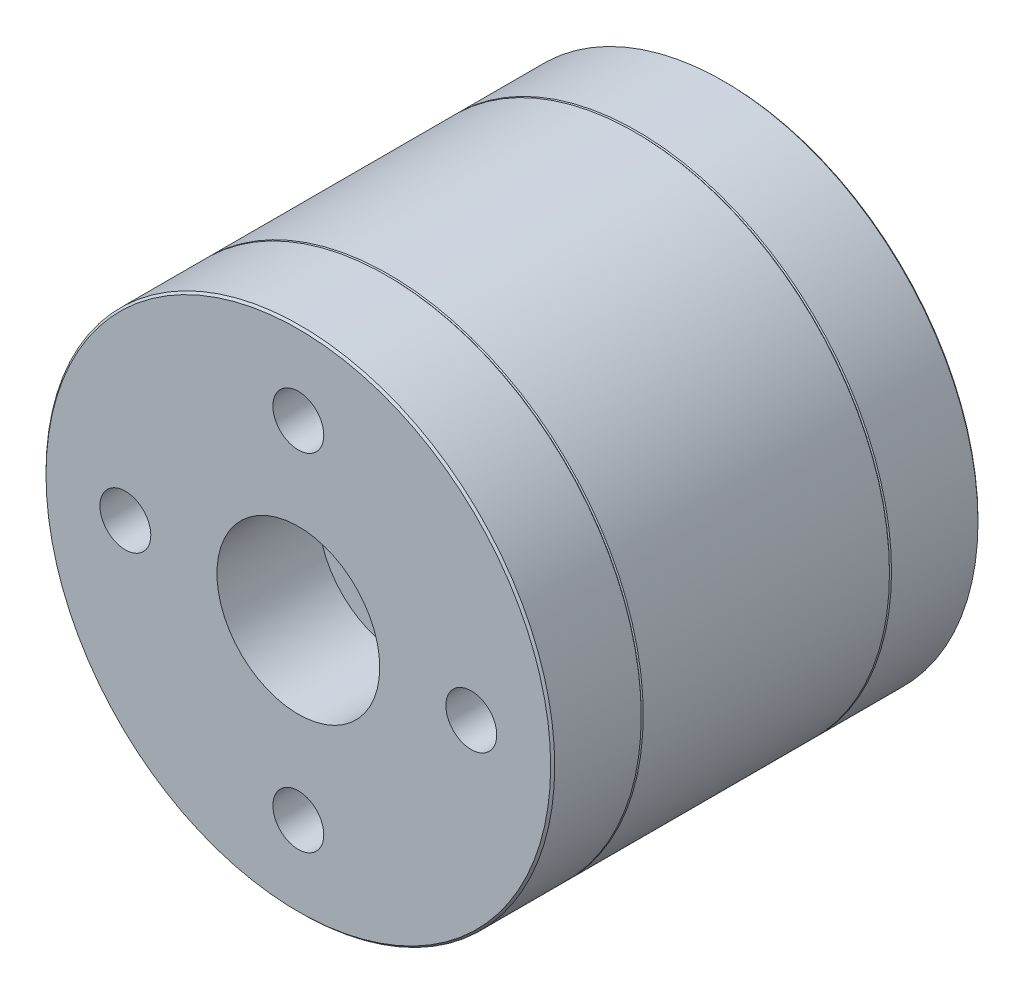
ISO-10303-21;
HEADER;
FILE_DESCRIPTION(('STEP AP214'),'2;1');
FILE_NAME('part.step','',(''),(''),'','','');
FILE_SCHEMA(('AUTOMOTIVE_DESIGN { 1 0 10303 214 1 1 1 1 }'));
ENDSEC;
DATA;
#1=APPLICATION_CONTEXT('core data for automotive mechanical design processes');
#2=APPLICATION_PROTOCOL_DEFINITION('international standard','automotive_design',2000,#1);
#3=PRODUCT_CONTEXT('',#1,'mechanical');
#4=PRODUCT('Part','Part','',(#3));
#5=PRODUCT_RELATED_PRODUCT_CATEGORY('part','',(#4));
#6=PRODUCT_DEFINITION_FORMATION('','',#4);
#7=PRODUCT_DEFINITION_CONTEXT('part definition',#1,'design');
#8=PRODUCT_DEFINITION('design','',#6,#7);
#9=PRODUCT_DEFINITION_SHAPE('','',#8);
#10=(LENGTH_UNIT() NAMED_UNIT(*) SI_UNIT(.MILLI.,.METRE.));
#11=(NAMED_UNIT(*) PLANE_ANGLE_UNIT() SI_UNIT($,.RADIAN.));
#12=(NAMED_UNIT(*) SI_UNIT($,.STERADIAN.) SOLID_ANGLE_UNIT());
#13=UNCERTAINTY_MEASURE_WITH_UNIT(LENGTH_MEASURE(1.E-05),#10,'distance_accuracy_value','');
#14=(GEOMETRIC_REPRESENTATION_CONTEXT(3) GLOBAL_UNCERTAINTY_ASSIGNED_CONTEXT((#13)) GLOBAL_UNIT_ASSIGNED_CONTEXT((#10,
#11,#12)) REPRESENTATION_CONTEXT('',''));
#15=CARTESIAN_POINT('',(0.,0.,0.));
#16=DIRECTION('',(0.,0.,1.));
#17=DIRECTION('',(1.,0.,0.));
#18=AXIS2_PLACEMENT_3D('',#15,#16,#17);
#19=CARTESIAN_POINT('',(-8.50000000000024,2.40543580379159E-13,10.501));
#20=DIRECTION('',(0.,0.,-1.));
#21=DIRECTION('',(-1.,0.,0.));
#22=AXIS2_PLACEMENT_3D('',#19,#20,#21);
#23=CYLINDRICAL_SURFACE('',#22,1.25000000000019);
#24=CARTESIAN_POINT('',(-8.50000000000024,2.40543580379159E-13,10.5));
#25=DIRECTION('',(0.,0.,1.));
#26=DIRECTION('',(1.,0.,0.));
#27=AXIS2_PLACEMENT_3D('',#24,#25,#26);
#28=CIRCLE('',#27,1.25000000000019);
#29=CARTESIAN_POINT('',(-7.25000000000005,2.40543580379159E-13,10.5));
#30=VERTEX_POINT('',#29);
#31=EDGE_CURVE('E134',#30,#30,#28,.F.);
#32=ORIENTED_EDGE('',*,*,#31,.F.);
#33=EDGE_LOOP('',(#32));
#34=FACE_BOUND('',#33,.T.);
#35=CARTESIAN_POINT('',(-8.50000000000024,2.40543580379159E-13,-7.5));
#36=DIRECTION('',(0.,0.,-1.));
#37=DIRECTION('',(-1.,0.,0.));
#38=AXIS2_PLACEMENT_3D('',#35,#36,#37);
#39=CIRCLE('',#38,1.25000000000019);
#40=CARTESIAN_POINT('',(-9.75000000000043,2.40543580379159E-13,-7.5));
#41=VERTEX_POINT('',#40);
#42=EDGE_CURVE('E62',#41,#41,#39,.F.);
#43=ORIENTED_EDGE('',*,*,#42,.F.);
#44=EDGE_LOOP('',(#43));
#45=FACE_BOUND('',#44,.T.);
#46=ADVANCED_FACE('F41',(#34,#45),#23,.F.);
#47=CARTESIAN_POINT('',(8.49999999999976,-2.41584530158434E-13,10.501));
#48=DIRECTION('',(0.,0.,-1.));
#49=DIRECTION('',(-1.,0.,0.));
#50=AXIS2_PLACEMENT_3D('',#47,#48,#49);
#51=CYLINDRICAL_SURFACE('',#50,1.25000000000039);
#52=CARTESIAN_POINT('',(8.49999999999976,-2.41584530158434E-13,10.5));
#53=DIRECTION('',(0.,0.,1.));
#54=DIRECTION('',(1.,0.,0.));
#55=AXIS2_PLACEMENT_3D('',#52,#53,#54);
#56=CIRCLE('',#55,1.25000000000039);
#57=CARTESIAN_POINT('',(9.75000000000015,-2.41584530158434E-13,10.5));
#58=VERTEX_POINT('',#57);
#59=EDGE_CURVE('E70',#58,#58,#56,.F.);
#60=ORIENTED_EDGE('',*,*,#59,.F.);
#61=EDGE_LOOP('',(#60));
#62=FACE_BOUND('',#61,.T.);
#63=CARTESIAN_POINT('',(8.49999999999976,-2.41584530158434E-13,-7.5));
#64=DIRECTION('',(0.,0.,-1.));
#65=DIRECTION('',(-1.,0.,0.));
#66=AXIS2_PLACEMENT_3D('',#63,#64,#65);
#67=CIRCLE('',#66,1.25000000000039);
#68=CARTESIAN_POINT('',(7.24999999999938,-2.41584530158434E-13,-7.5));
#69=VERTEX_POINT('',#68);
#70=EDGE_CURVE('E67',#69,#69,#67,.F.);
#71=ORIENTED_EDGE('',*,*,#70,.F.);
#72=EDGE_LOOP('',(#71));
#73=FACE_BOUND('',#72,.T.);
#74=ADVANCED_FACE('F170',(#62,#73),#51,.F.);
#75=CARTESIAN_POINT('',(0.,0.,10.501));
#76=DIRECTION('',(0.,0.,-1.));
#77=DIRECTION('',(-1.,0.,0.));
#78=AXIS2_PLACEMENT_3D('',#75,#76,#77);
#79=CYLINDRICAL_SURFACE('',#78,2.);
#80=CARTESIAN_POINT('',(0.,0.,-12.8));
#81=DIRECTION('',(0.,0.,-1.));
#82=DIRECTION('',(-1.,0.,0.));
#83=AXIS2_PLACEMENT_3D('',#80,#81,#82);
#84=CIRCLE('',#83,2.);
#85=CARTESIAN_POINT('',(-2.,0.,-12.8));
#86=VERTEX_POINT('',#85);
#87=EDGE_CURVE('E79',#86,#86,#84,.T.);
#88=ORIENTED_EDGE('',*,*,#87,.T.);
#89=EDGE_LOOP('',(#88));
#90=FACE_BOUND('',#89,.T.);
#91=CARTESIAN_POINT('',(0.,0.,5.5));
#92=DIRECTION('',(0.,0.,1.));
#93=DIRECTION('',(1.,0.,0.));
#94=AXIS2_PLACEMENT_3D('',#91,#92,#93);
#95=CIRCLE('',#94,2.);
#96=CARTESIAN_POINT('',(2.,0.,5.5));
#97=VERTEX_POINT('',#96);
#98=EDGE_CURVE('E83',#97,#97,#95,.F.);
#99=ORIENTED_EDGE('',*,*,#98,.F.);
#100=EDGE_LOOP('',(#99));
#101=FACE_BOUND('',#100,.T.);
#102=ADVANCED_FACE('F178',(#90,#101),#79,.F.);
#103=CARTESIAN_POINT('',(0.,0.,-9.5));
#104=DIRECTION('',(0.,0.,-1.));
#105=DIRECTION('',(-1.,0.,0.));
#106=AXIS2_PLACEMENT_3D('',#103,#104,#105);
#107=PLANE('',#106);
#108=CARTESIAN_POINT('',(0.,0.,-9.5));
#109=DIRECTION('',(0.,0.,-1.));
#110=DIRECTION('',(-1.,0.,0.));
#111=AXIS2_PLACEMENT_3D('',#108,#109,#110);
#112=CIRCLE('',#111,3.51);
#113=CARTESIAN_POINT('',(-3.51,0.,-9.5));
#114=VERTEX_POINT('',#113);
#115=EDGE_CURVE('E117',#114,#114,#112,.T.);
#116=ORIENTED_EDGE('',*,*,#115,.T.);
#117=EDGE_LOOP('',(#116));
#118=FACE_BOUND('',#117,.T.);
#119=CARTESIAN_POINT('',(0.,0.,-9.5));
#120=DIRECTION('',(0.,0.,-1.));
#121=DIRECTION('',(-1.,0.,0.));
#122=AXIS2_PLACEMENT_3D('',#119,#120,#121);
#123=CIRCLE('',#122,3.5);
#124=CARTESIAN_POINT('',(-3.5,0.,-9.5));
#125=VERTEX_POINT('',#124);
#126=EDGE_CURVE('E86',#125,#125,#123,.T.);
#127=ORIENTED_EDGE('',*,*,#126,.F.);
#128=EDGE_LOOP('',(#127));
#129=FACE_BOUND('',#128,.T.);
#130=ADVANCED_FACE('F203',(#118,#129),#107,.T.);
#131=CARTESIAN_POINT('',(0.,0.,10.5));
#132=DIRECTION('',(0.,0.,-1.));
#133=DIRECTION('',(-1.,0.,0.));
#134=AXIS2_PLACEMENT_3D('',#131,#132,#133);
#135=CYLINDRICAL_SURFACE('',#134,12.5);
#136=CARTESIAN_POINT('',(0.,0.,6.05));
#137=DIRECTION('',(0.,0.,1.));
#138=DIRECTION('',(1.,0.,0.));
#139=AXIS2_PLACEMENT_3D('',#136,#137,#138);
#140=CIRCLE('',#139,12.5);
#141=CARTESIAN_POINT('',(-12.5,0.,6.05));
#142=VERTEX_POINT('',#141);
#143=EDGE_CURVE('E102',#142,#142,#140,.T.);
#144=CARTESIAN_POINT('',(0.,0.,-6.05));
#145=DIRECTION('',(0.,0.,1.));
#146=DIRECTION('',(1.,0.,0.));
#147=AXIS2_PLACEMENT_3D('',#144,#145,#146);
#148=CIRCLE('',#147,12.5);
#149=CARTESIAN_POINT('',(-12.5,0.,-6.05000000000001));
#150=VERTEX_POINT('',#149);
#151=EDGE_CURVE('E114',#150,#150,#148,.T.);
#152=CARTESIAN_POINT('',(-12.5,0.,6.05));
#153=CARTESIAN_POINT('',(-12.5,0.,5.92395833333333));
#154=CARTESIAN_POINT('',(-12.5,0.,5.79791666666667));
#155=CARTESIAN_POINT('',(-12.5,0.,5.54583333333333));
#156=CARTESIAN_POINT('',(-12.5,0.,5.41979166666667));
#157=CARTESIAN_POINT('',(-12.5,0.,5.16770833333333));
#158=CARTESIAN_POINT('',(-12.5,0.,5.04166666666667));
#159=CARTESIAN_POINT('',(-12.5,0.,4.78958333333333));
#160=CARTESIAN_POINT('',(-12.5,0.,4.66354166666666));
#161=CARTESIAN_POINT('',(-12.5,0.,4.41145833333333));
#162=CARTESIAN_POINT('',(-12.5,0.,4.28541666666666));
#163=CARTESIAN_POINT('',(-12.5,0.,4.03333333333333));
#164=CARTESIAN_POINT('',(-12.5,0.,3.90729166666666));
#165=CARTESIAN_POINT('',(-12.5,0.,3.65520833333333));
#166=CARTESIAN_POINT('',(-12.5,0.,3.52916666666666));
#167=CARTESIAN_POINT('',(-12.5,0.,3.27708333333333));
#168=CARTESIAN_POINT('',(-12.5,0.,3.15104166666666));
#169=CARTESIAN_POINT('',(-12.5,0.,2.89895833333333));
#170=CARTESIAN_POINT('',(-12.5,0.,2.77291666666666));
#171=CARTESIAN_POINT('',(-12.5,0.,2.52083333333333));
#172=CARTESIAN_POINT('',(-12.5,0.,2.39479166666666));
#173=CARTESIAN_POINT('',(-12.5,0.,2.14270833333333));
#174=CARTESIAN_POINT('',(-12.5,0.,2.01666666666666));
#175=CARTESIAN_POINT('',(-12.5,0.,1.76458333333333));
#176=CARTESIAN_POINT('',(-12.5,0.,1.63854166666666));
#177=CARTESIAN_POINT('',(-12.5,0.,1.38645833333333));
#178=CARTESIAN_POINT('',(-12.5,0.,1.26041666666666));
#179=CARTESIAN_POINT('',(-12.5,0.,1.00833333333333));
#180=CARTESIAN_POINT('',(-12.5,0.,0.882291666666663));
#181=CARTESIAN_POINT('',(-12.5,0.,0.63020833333333));
#182=CARTESIAN_POINT('',(-12.5,0.,0.504166666666663));
#183=CARTESIAN_POINT('',(-12.5,0.,0.25208333333333));
#184=CARTESIAN_POINT('',(-12.5,0.,0.126041666666663));
#185=CARTESIAN_POINT('',(-12.5,0.,-0.12604166666667));
#186=CARTESIAN_POINT('',(-12.5,0.,-0.252083333333337));
#187=CARTESIAN_POINT('',(-12.5,0.,-0.50416666666667));
#188=CARTESIAN_POINT('',(-12.5,0.,-0.630208333333337));
#189=CARTESIAN_POINT('',(-12.5,0.,-0.88229166666667));
#190=CARTESIAN_POINT('',(-12.5,0.,-1.00833333333334));
#191=CARTESIAN_POINT('',(-12.5,0.,-1.26041666666667));
#192=CARTESIAN_POINT('',(-12.5,0.,-1.38645833333334));
#193=CARTESIAN_POINT('',(-12.5,0.,-1.63854166666667));
#194=CARTESIAN_POINT('',(-12.5,0.,-1.76458333333334));
#195=CARTESIAN_POINT('',(-12.5,0.,-2.01666666666667));
#196=CARTESIAN_POINT('',(-12.5,0.,-2.14270833333334));
#197=CARTESIAN_POINT('',(-12.5,0.,-2.39479166666667));
#198=CARTESIAN_POINT('',(-12.5,0.,-2.52083333333334));
#199=CARTESIAN_POINT('',(-12.5,0.,-2.77291666666667));
#200=CARTESIAN_POINT('',(-12.5,0.,-2.89895833333334));
#201=CARTESIAN_POINT('',(-12.5,0.,-3.15104166666667));
#202=CARTESIAN_POINT('',(-12.5,0.,-3.27708333333334));
#203=CARTESIAN_POINT('',(-12.5,0.,-3.52916666666667));
#204=CARTESIAN_POINT('',(-12.5,0.,-3.65520833333334));
#205=CARTESIAN_POINT('',(-12.5,0.,-3.90729166666667));
#206=CARTESIAN_POINT('',(-12.5,0.,-4.03333333333334));
#207=CARTESIAN_POINT('',(-12.5,0.,-4.28541666666667));
#208=CARTESIAN_POINT('',(-12.5,0.,-4.41145833333334));
#209=CARTESIAN_POINT('',(-12.5,0.,-4.66354166666667));
#210=CARTESIAN_POINT('',(-12.5,0.,-4.78958333333334));
#211=CARTESIAN_POINT('',(-12.5,0.,-5.04166666666667));
#212=CARTESIAN_POINT('',(-12.5,0.,-5.16770833333334));
#213=CARTESIAN_POINT('',(-12.5,0.,-5.41979166666667));
#214=CARTESIAN_POINT('',(-12.5,0.,-5.54583333333334));
#215=CARTESIAN_POINT('',(-12.5,0.,-5.79791666666667));
#216=CARTESIAN_POINT('',(-12.5,0.,-5.92395833333334));
#217=CARTESIAN_POINT('',(-12.5,0.,-6.05000000000001));
#218=B_SPLINE_CURVE_WITH_KNOTS('',3,(#152,#153,#154,#155,#156,#157,#158,#159,#160,#161,#162,
#163,#164,#165,#166,#167,#168,#169,#170,#171,#172,#173,#174,#175,#176,#177,#178,#179,#180,#181,
#182,#183,#184,#185,#186,#187,#188,#189,#190,#191,#192,#193,#194,#195,#196,#197,#198,#199,#200,
#201,#202,#203,#204,#205,#206,#207,#208,#209,#210,#211,#212,#213,#214,#215,#216,#217),
.UNSPECIFIED.,.F.,.F.,(4,2,2,2,2,2,2,2,2,2,2,2,2,2,2,2,2,2,2,2,2,2,2,2,2,2,2,2,2,2,2,2,4),(0.,
0.378125,0.75625,1.134375,1.5125,1.890625,2.26875,2.646875,3.025,3.403125,3.78125,4.159375,
4.5375,4.915625,5.29375,5.671875,6.05,6.428125,6.80625,7.184375,7.5625,7.940625,8.31875,
8.696875,9.075,9.453125,9.83125,10.209375,10.5875,10.965625,11.34375,11.721875,12.1),.UNSPECIFIED.);
#219=EDGE_CURVE('BSEAM215',#142,#150,#218,.T.);
#220=ORIENTED_EDGE('',*,*,#143,.F.);
#221=ORIENTED_EDGE('',*,*,#151,.T.);
#222=ORIENTED_EDGE('',*,*,#219,.T.);
#223=ORIENTED_EDGE('',*,*,#219,.F.);
#224=EDGE_LOOP('',(#220,#222,#221,#223));
#225=FACE_BOUND('',#224,.T.);
#226=ADVANCED_FACE('F215',(#225),#135,.T.);
#227=CARTESIAN_POINT('',(0.,0.,10.4));
#228=DIRECTION('',(0.,0.,1.));
#229=DIRECTION('',(1.,0.,0.));
#230=AXIS2_PLACEMENT_3D('',#227,#228,#229);
#231=CIRCLE('',#230,12.5);
#232=CARTESIAN_POINT('',(-12.5,0.,10.4));
#233=VERTEX_POINT('',#232);
#234=EDGE_CURVE('E93',#233,#233,#231,.F.);
#235=CARTESIAN_POINT('',(0.,0.,6.15));
#236=DIRECTION('',(0.,0.,1.));
#237=DIRECTION('',(1.,0.,0.));
#238=AXIS2_PLACEMENT_3D('',#235,#236,#237);
#239=CIRCLE('',#238,12.5);
#240=CARTESIAN_POINT('',(-12.5,0.,6.15));
#241=VERTEX_POINT('',#240);
#242=EDGE_CURVE('E105',#241,#241,#239,.T.);
#243=CARTESIAN_POINT('',(-12.5,0.,10.4));
#244=CARTESIAN_POINT('',(-12.5,0.,10.3557291666667));
#245=CARTESIAN_POINT('',(-12.5,0.,10.3114583333334));
#246=CARTESIAN_POINT('',(-12.5,0.,10.2229166666667));
#247=CARTESIAN_POINT('',(-12.5,0.,10.1786458333334));
#248=CARTESIAN_POINT('',(-12.5,0.,10.0901041666667));
#249=CARTESIAN_POINT('',(-12.5,0.,10.0458333333334));
#250=CARTESIAN_POINT('',(-12.5,0.,9.95729166666669));
#251=CARTESIAN_POINT('',(-12.5,0.,9.91302083333335));
#252=CARTESIAN_POINT('',(-12.5,0.,9.82447916666668));
#253=CARTESIAN_POINT('',(-12.5,0.,9.78020833333335));
#254=CARTESIAN_POINT('',(-12.5,0.,9.69166666666668));
#255=CARTESIAN_POINT('',(-12.5,0.,9.64739583333335));
#256=CARTESIAN_POINT('',(-12.5,0.,9.55885416666668));
#257=CARTESIAN_POINT('',(-12.5,0.,9.51458333333335));
#258=CARTESIAN_POINT('',(-12.5,0.,9.42604166666668));
#259=CARTESIAN_POINT('',(-12.5,0.,9.38177083333335));
#260=CARTESIAN_POINT('',(-12.5,0.,9.29322916666668));
#261=CARTESIAN_POINT('',(-12.5,0.,9.24895833333335));
#262=CARTESIAN_POINT('',(-12.5,0.,9.16041666666668));
#263=CARTESIAN_POINT('',(-12.5,0.,9.11614583333335));
#264=CARTESIAN_POINT('',(-12.5,0.,9.02760416666668));
#265=CARTESIAN_POINT('',(-12.5,0.,8.98333333333335));
#266=CARTESIAN_POINT('',(-12.5,0.,8.89479166666668));
#267=CARTESIAN_POINT('',(-12.5,0.,8.85052083333334));
#268=CARTESIAN_POINT('',(-12.5,0.,8.76197916666668));
#269=CARTESIAN_POINT('',(-12.5,0.,8.71770833333335));
#270=CARTESIAN_POINT('',(-12.5,0.,8.62916666666668));
#271=CARTESIAN_POINT('',(-12.5,0.,8.58489583333334));
#272=CARTESIAN_POINT('',(-12.5,0.,8.49635416666668));
#273=CARTESIAN_POINT('',(-12.5,0.,8.45208333333334));
#274=CARTESIAN_POINT('',(-12.5,0.,8.36354166666668));
#275=CARTESIAN_POINT('',(-12.5,0.,8.31927083333334));
#276=CARTESIAN_POINT('',(-12.5,0.,8.23072916666668));
#277=CARTESIAN_POINT('',(-12.5,0.,8.18645833333334));
#278=CARTESIAN_POINT('',(-12.5,0.,8.09791666666668));
#279=CARTESIAN_POINT('',(-12.5,0.,8.05364583333334));
#280=CARTESIAN_POINT('',(-12.5,0.,7.96510416666667));
#281=CARTESIAN_POINT('',(-12.5,0.,7.92083333333334));
#282=CARTESIAN_POINT('',(-12.5,0.,7.83229166666667));
#283=CARTESIAN_POINT('',(-12.5,0.,7.78802083333334));
#284=CARTESIAN_POINT('',(-12.5,0.,7.69947916666667));
#285=CARTESIAN_POINT('',(-12.5,0.,7.65520833333334));
#286=CARTESIAN_POINT('',(-12.5,0.,7.56666666666667));
#287=CARTESIAN_POINT('',(-12.5,0.,7.52239583333334));
#288=CARTESIAN_POINT('',(-12.5,0.,7.43385416666667));
#289=CARTESIAN_POINT('',(-12.5,0.,7.38958333333334));
#290=CARTESIAN_POINT('',(-12.5,0.,7.30104166666667));
#291=CARTESIAN_POINT('',(-12.5,0.,7.25677083333334));
#292=CARTESIAN_POINT('',(-12.5,0.,7.16822916666667));
#293=CARTESIAN_POINT('',(-12.5,0.,7.12395833333334));
#294=CARTESIAN_POINT('',(-12.5,0.,7.03541666666667));
#295=CARTESIAN_POINT('',(-12.5,0.,6.99114583333334));
#296=CARTESIAN_POINT('',(-12.5,0.,6.90260416666667));
#297=CARTESIAN_POINT('',(-12.5,0.,6.85833333333334));
#298=CARTESIAN_POINT('',(-12.5,0.,6.76979166666667));
#299=CARTESIAN_POINT('',(-12.5,0.,6.72552083333334));
#300=CARTESIAN_POINT('',(-12.5,0.,6.63697916666667));
#301=CARTESIAN_POINT('',(-12.5,0.,6.59270833333333));
#302=CARTESIAN_POINT('',(-12.5,0.,6.50416666666667));
#303=CARTESIAN_POINT('',(-12.5,0.,6.45989583333333));
#304=CARTESIAN_POINT('',(-12.5,0.,6.37135416666667));
#305=CARTESIAN_POINT('',(-12.5,0.,6.32708333333333));
#306=CARTESIAN_POINT('',(-12.5,0.,6.23854166666667));
#307=CARTESIAN_POINT('',(-12.5,0.,6.19427083333333));
#308=CARTESIAN_POINT('',(-12.5,0.,6.15));
#309=B_SPLINE_CURVE_WITH_KNOTS('',3,(#243,#244,#245,#246,#247,#248,#249,#250,#251,#252,#253,
#254,#255,#256,#257,#258,#259,#260,#261,#262,#263,#264,#265,#266,#267,#268,#269,#270,#271,#272,
#273,#274,#275,#276,#277,#278,#279,#280,#281,#282,#283,#284,#285,#286,#287,#288,#289,#290,#291,
#292,#293,#294,#295,#296,#297,#298,#299,#300,#301,#302,#303,#304,#305,#306,#307,#308),
.UNSPECIFIED.,.F.,.F.,(4,2,2,2,2,2,2,2,2,2,2,2,2,2,2,2,2,2,2,2,2,2,2,2,2,2,2,2,2,2,2,2,4),(0.,
0.132812500000001,0.265625000000002,0.398437500000003,0.531250000000004,0.664062500000005,
0.796875000000006,0.929687500000005,1.06250000000001,1.19531250000001,1.32812500000001,
1.46093750000001,1.59375000000001,1.72656250000001,1.85937500000001,1.99218750000001,
2.12500000000001,2.25781250000001,2.39062500000001,2.52343750000002,2.65625000000002,
2.78906250000002,2.92187500000002,3.05468750000002,3.18750000000002,3.32031250000002,
3.45312500000002,3.58593750000002,3.71875000000002,3.85156250000002,3.98437500000002,
4.11718750000002,4.25000000000002),.UNSPECIFIED.);
#310=EDGE_CURVE('BSEAM241',#233,#241,#309,.T.);
#311=ORIENTED_EDGE('',*,*,#234,.T.);
#312=ORIENTED_EDGE('',*,*,#242,.T.);
#313=ORIENTED_EDGE('',*,*,#310,.T.);
#314=ORIENTED_EDGE('',*,*,#310,.F.);
#315=EDGE_LOOP('',(#311,#313,#312,#314));
#316=FACE_BOUND('',#315,.T.);
#317=ADVANCED_FACE('F241',(#316),#135,.T.);
#318=CARTESIAN_POINT('',(0.,0.,10.5));
#319=DIRECTION('',(0.,0.,1.));
#320=DIRECTION('',(1.,0.,0.));
#321=AXIS2_PLACEMENT_3D('',#318,#319,#320);
#322=PLANE('',#321);
#323=ORIENTED_EDGE('',*,*,#59,.T.);
#324=EDGE_LOOP('',(#323));
#325=FACE_BOUND('',#324,.T.);
#326=CARTESIAN_POINT('',(-4.81087160758318E-13,-8.5,10.5));
#327=DIRECTION('',(0.,0.,1.));
#328=DIRECTION('',(1.,0.,0.));
#329=AXIS2_PLACEMENT_3D('',#326,#327,#328);
#330=CIRCLE('',#329,1.25000000000052);
#331=CARTESIAN_POINT('',(1.25000000000004,-8.5,10.5));
#332=VERTEX_POINT('',#331);
#333=EDGE_CURVE('E140',#332,#332,#330,.F.);
#334=ORIENTED_EDGE('',*,*,#333,.T.);
#335=EDGE_LOOP('',(#334));
#336=FACE_BOUND('',#335,.T.);
#337=ORIENTED_EDGE('',*,*,#31,.T.);
#338=EDGE_LOOP('',(#337));
#339=FACE_BOUND('',#338,.T.);
#340=CARTESIAN_POINT('',(0.,8.5,10.5));
#341=DIRECTION('',(0.,0.,1.));
#342=DIRECTION('',(1.,0.,0.));
#343=AXIS2_PLACEMENT_3D('',#340,#341,#342);
#344=CIRCLE('',#343,1.25);
#345=CARTESIAN_POINT('',(1.25,8.5,10.5));
#346=VERTEX_POINT('',#345);
#347=EDGE_CURVE('E131',#346,#346,#344,.F.);
#348=ORIENTED_EDGE('',*,*,#347,.T.);
#349=EDGE_LOOP('',(#348));
#350=FACE_BOUND('',#349,.T.);
#351=CARTESIAN_POINT('',(0.,0.,10.5));
#352=DIRECTION('',(0.,0.,1.));
#353=DIRECTION('',(1.,0.,0.));
#354=AXIS2_PLACEMENT_3D('',#351,#352,#353);
#355=CIRCLE('',#354,4.);
#356=CARTESIAN_POINT('',(4.,0.,10.5));
#357=VERTEX_POINT('',#356);
#358=EDGE_CURVE('E125',#357,#357,#355,.T.);
#359=ORIENTED_EDGE('',*,*,#358,.F.);
#360=EDGE_LOOP('',(#359));
#361=FACE_BOUND('',#360,.T.);
#362=CARTESIAN_POINT('',(0.,0.,10.5));
#363=DIRECTION('',(0.,0.,1.));
#364=DIRECTION('',(1.,0.,0.));
#365=AXIS2_PLACEMENT_3D('',#362,#363,#364);
#366=CIRCLE('',#365,12.4);
#367=CARTESIAN_POINT('',(12.4,0.,10.5));
#368=VERTEX_POINT('',#367);
#369=EDGE_CURVE('E96',#368,#368,#366,.T.);
#370=ORIENTED_EDGE('',*,*,#369,.T.);
#371=EDGE_LOOP('',(#370));
#372=FACE_BOUND('',#371,.T.);
#373=ADVANCED_FACE('F237',(#325,#336,#339,#350,#361,#372),#322,.T.);
#374=CARTESIAN_POINT('',(0.,0.,6.15));
#375=DIRECTION('',(0.,0.,1.));
#376=DIRECTION('',(1.,0.,0.));
#377=AXIS2_PLACEMENT_3D('',#374,#375,#376);
#378=CONICAL_SURFACE('',#377,12.5,0.785398163397431);
#379=CARTESIAN_POINT('',(0.,0.,6.1));
#380=DIRECTION('',(0.,0.,1.));
#381=DIRECTION('',(1.,0.,0.));
#382=AXIS2_PLACEMENT_3D('',#379,#380,#381);
#383=CIRCLE('',#382,12.45);
#384=CARTESIAN_POINT('',(12.45,0.,6.1));
#385=VERTEX_POINT('',#384);
#386=EDGE_CURVE('E99',#385,#385,#383,.T.);
#387=ORIENTED_EDGE('',*,*,#386,.T.);
#388=EDGE_LOOP('',(#387));
#389=FACE_BOUND('',#388,.T.);
#390=ORIENTED_EDGE('',*,*,#242,.F.);
#391=EDGE_LOOP('',(#390));
#392=FACE_BOUND('',#391,.T.);
#393=ADVANCED_FACE('F233',(#389,#392),#378,.T.);
#394=CARTESIAN_POINT('',(0.,0.,6.1));
#395=DIRECTION('',(0.,0.,-1.));
#396=DIRECTION('',(-1.,0.,0.));
#397=AXIS2_PLACEMENT_3D('',#394,#395,#396);
#398=CONICAL_SURFACE('',#397,12.45,0.785398163397448);
#399=ORIENTED_EDGE('',*,*,#143,.T.);
#400=EDGE_LOOP('',(#399));
#401=FACE_BOUND('',#400,.T.);
#402=ORIENTED_EDGE('',*,*,#386,.F.);
#403=EDGE_LOOP('',(#402));
#404=FACE_BOUND('',#403,.T.);
#405=ADVANCED_FACE('F229',(#401,#404),#398,.T.);
#406=CARTESIAN_POINT('',(0.,0.,-6.05));
#407=DIRECTION('',(0.,0.,1.));
#408=DIRECTION('',(1.,0.,0.));
#409=AXIS2_PLACEMENT_3D('',#406,#407,#408);
#410=CONICAL_SURFACE('',#409,12.5,0.785398163397431);
#411=CARTESIAN_POINT('',(0.,0.,-6.1));
#412=DIRECTION('',(0.,0.,1.));
#413=DIRECTION('',(1.,0.,0.));
#414=AXIS2_PLACEMENT_3D('',#411,#412,#413);
#415=CIRCLE('',#414,12.45);
#416=CARTESIAN_POINT('',(12.45,0.,-6.1));
#417=VERTEX_POINT('',#416);
#418=EDGE_CURVE('E108',#417,#417,#415,.T.);
#419=ORIENTED_EDGE('',*,*,#418,.T.);
#420=EDGE_LOOP('',(#419));
#421=FACE_BOUND('',#420,.T.);
#422=ORIENTED_EDGE('',*,*,#151,.F.);
#423=EDGE_LOOP('',(#422));
#424=FACE_BOUND('',#423,.T.);
#425=ADVANCED_FACE('F225',(#421,#424),#410,.T.);
#426=CARTESIAN_POINT('',(0.,0.,-6.1));
#427=DIRECTION('',(0.,0.,-1.));
#428=DIRECTION('',(-1.,0.,0.));
#429=AXIS2_PLACEMENT_3D('',#426,#427,#428);
#430=CONICAL_SURFACE('',#429,12.45,0.785398163397448);
#431=CARTESIAN_POINT('',(0.,0.,-6.15));
#432=DIRECTION('',(0.,0.,1.));
#433=DIRECTION('',(1.,0.,0.));
#434=AXIS2_PLACEMENT_3D('',#431,#432,#433);
#435=CIRCLE('',#434,12.5);
#436=CARTESIAN_POINT('',(-12.5,0.,-6.15));
#437=VERTEX_POINT('',#436);
#438=EDGE_CURVE('E111',#437,#437,#435,.T.);
#439=ORIENTED_EDGE('',*,*,#438,.T.);
#440=EDGE_LOOP('',(#439));
#441=FACE_BOUND('',#440,.T.);
#442=ORIENTED_EDGE('',*,*,#418,.F.);
#443=EDGE_LOOP('',(#442));
#444=FACE_BOUND('',#443,.T.);
#445=ADVANCED_FACE('F221',(#441,#444),#430,.T.);
#446=CARTESIAN_POINT('',(0.,0.,-10.5));
#447=DIRECTION('',(0.,0.,1.));
#448=DIRECTION('',(1.,0.,0.));
#449=AXIS2_PLACEMENT_3D('',#446,#447,#448);
#450=PLANE('',#449);
#451=CARTESIAN_POINT('',(-8.50000000000024,2.40543580379159E-13,-10.5));
#452=DIRECTION('',(0.,0.,1.));
#453=DIRECTION('',(1.,0.,0.));
#454=AXIS2_PLACEMENT_3D('',#451,#452,#453);
#455=CIRCLE('',#454,2.75000000000001);
#456=CARTESIAN_POINT('',(-5.75000000000023,2.40543580379159E-13,-10.5));
#457=VERTEX_POINT('',#456);
#458=EDGE_CURVE('E48',#457,#457,#455,.T.);
#459=ORIENTED_EDGE('',*,*,#458,.T.);
#460=EDGE_LOOP('',(#459));
#461=FACE_BOUND('',#460,.T.);
#462=CARTESIAN_POINT('',(8.49999999999976,-2.41584530158434E-13,-10.5));
#463=DIRECTION('',(0.,0.,1.));
#464=DIRECTION('',(1.,0.,0.));
#465=AXIS2_PLACEMENT_3D('',#462,#463,#464);
#466=CIRCLE('',#465,2.75);
#467=CARTESIAN_POINT('',(11.2499999999998,-2.41584530158434E-13,-10.5));
#468=VERTEX_POINT('',#467);
#469=EDGE_CURVE('E52',#468,#468,#466,.T.);
#470=ORIENTED_EDGE('',*,*,#469,.T.);
#471=EDGE_LOOP('',(#470));
#472=FACE_BOUND('',#471,.T.);
#473=CARTESIAN_POINT('',(-4.81087160758318E-13,-8.5,-10.5));
#474=DIRECTION('',(0.,0.,-1.));
#475=DIRECTION('',(-1.,0.,0.));
#476=AXIS2_PLACEMENT_3D('',#473,#474,#475);
#477=CIRCLE('',#476,1.25000000000052);
#478=CARTESIAN_POINT('',(-1.250000000001,-8.5,-10.5));
#479=VERTEX_POINT('',#478);
#480=EDGE_CURVE('E139',#479,#479,#477,.T.);
#481=ORIENTED_EDGE('',*,*,#480,.F.);
#482=EDGE_LOOP('',(#481));
#483=FACE_BOUND('',#482,.T.);
#484=CARTESIAN_POINT('',(0.,8.5,-10.5));
#485=DIRECTION('',(0.,0.,-1.));
#486=DIRECTION('',(-1.,0.,0.));
#487=AXIS2_PLACEMENT_3D('',#484,#485,#486);
#488=CIRCLE('',#487,1.25);
#489=CARTESIAN_POINT('',(-1.25,8.5,-10.5));
#490=VERTEX_POINT('',#489);
#491=EDGE_CURVE('E128',#490,#490,#488,.T.);
#492=ORIENTED_EDGE('',*,*,#491,.F.);
#493=EDGE_LOOP('',(#492));
#494=FACE_BOUND('',#493,.T.);
#495=CARTESIAN_POINT('',(0.,0.,-10.5));
#496=DIRECTION('',(0.,0.,-1.));
#497=DIRECTION('',(-1.,0.,0.));
#498=AXIS2_PLACEMENT_3D('',#495,#496,#497);
#499=CIRCLE('',#498,3.51);
#500=CARTESIAN_POINT('',(-3.51,0.,-10.5));
#501=VERTEX_POINT('',#500);
#502=EDGE_CURVE('E118',#501,#501,#499,.T.);
#503=ORIENTED_EDGE('',*,*,#502,.F.);
#504=EDGE_LOOP('',(#503));
#505=FACE_BOUND('',#504,.T.);
#506=CARTESIAN_POINT('',(0.,0.,-10.5));
#507=DIRECTION('',(0.,0.,1.));
#508=DIRECTION('',(1.,0.,0.));
#509=AXIS2_PLACEMENT_3D('',#506,#507,#508);
#510=CIRCLE('',#509,12.4);
#511=CARTESIAN_POINT('',(12.4,0.,-10.5));
#512=VERTEX_POINT('',#511);
#513=EDGE_CURVE('E82',#512,#512,#510,.F.);
#514=ORIENTED_EDGE('',*,*,#513,.T.);
#515=EDGE_LOOP('',(#514));
#516=FACE_BOUND('',#515,.T.);
#517=ADVANCED_FACE('F224',(#461,#472,#483,#494,#505,#516),#450,.F.);
#518=CARTESIAN_POINT('',(0.,0.,-10.4));
#519=DIRECTION('',(0.,0.,1.));
#520=DIRECTION('',(1.,0.,0.));
#521=AXIS2_PLACEMENT_3D('',#518,#519,#520);
#522=CIRCLE('',#521,12.5);
#523=CARTESIAN_POINT('',(-12.5,0.,-10.4));
#524=VERTEX_POINT('',#523);
#525=EDGE_CURVE('E90',#524,#524,#522,.T.);
#526=CARTESIAN_POINT('',(-12.5,0.,-10.4));
#527=CARTESIAN_POINT('',(-12.5,0.,-10.3557291666666));
#528=CARTESIAN_POINT('',(-12.5,0.,-10.3114583333333));
#529=CARTESIAN_POINT('',(-12.5,0.,-10.2229166666666));
#530=CARTESIAN_POINT('',(-12.5,0.,-10.1786458333333));
#531=CARTESIAN_POINT('',(-12.5,0.,-10.0901041666666));
#532=CARTESIAN_POINT('',(-12.5,0.,-10.0458333333333));
#533=CARTESIAN_POINT('',(-12.5,0.,-9.95729166666664));
#534=CARTESIAN_POINT('',(-12.5,0.,-9.91302083333331));
#535=CARTESIAN_POINT('',(-12.5,0.,-9.82447916666664));
#536=CARTESIAN_POINT('',(-12.5,0.,-9.78020833333331));
#537=CARTESIAN_POINT('',(-12.5,0.,-9.69166666666664));
#538=CARTESIAN_POINT('',(-12.5,0.,-9.64739583333331));
#539=CARTESIAN_POINT('',(-12.5,0.,-9.55885416666664));
#540=CARTESIAN_POINT('',(-12.5,0.,-9.51458333333331));
#541=CARTESIAN_POINT('',(-12.5,0.,-9.42604166666664));
#542=CARTESIAN_POINT('',(-12.5,0.,-9.38177083333331));
#543=CARTESIAN_POINT('',(-12.5,0.,-9.29322916666664));
#544=CARTESIAN_POINT('',(-12.5,0.,-9.24895833333331));
#545=CARTESIAN_POINT('',(-12.5,0.,-9.16041666666665));
#546=CARTESIAN_POINT('',(-12.5,0.,-9.11614583333331));
#547=CARTESIAN_POINT('',(-12.5,0.,-9.02760416666665));
#548=CARTESIAN_POINT('',(-12.5,0.,-8.98333333333331));
#549=CARTESIAN_POINT('',(-12.5,0.,-8.89479166666665));
#550=CARTESIAN_POINT('',(-12.5,0.,-8.85052083333332));
#551=CARTESIAN_POINT('',(-12.5,0.,-8.76197916666665));
#552=CARTESIAN_POINT('',(-12.5,0.,-8.71770833333332));
#553=CARTESIAN_POINT('',(-12.5,0.,-8.62916666666665));
#554=CARTESIAN_POINT('',(-12.5,0.,-8.58489583333332));
#555=CARTESIAN_POINT('',(-12.5,0.,-8.49635416666665));
#556=CARTESIAN_POINT('',(-12.5,0.,-8.45208333333332));
#557=CARTESIAN_POINT('',(-12.5,0.,-8.36354166666665));
#558=CARTESIAN_POINT('',(-12.5,0.,-8.31927083333332));
#559=CARTESIAN_POINT('',(-12.5,0.,-8.23072916666665));
#560=CARTESIAN_POINT('',(-12.5,0.,-8.18645833333332));
#561=CARTESIAN_POINT('',(-12.5,0.,-8.09791666666665));
#562=CARTESIAN_POINT('',(-12.5,0.,-8.05364583333332));
#563=CARTESIAN_POINT('',(-12.5,0.,-7.96510416666665));
#564=CARTESIAN_POINT('',(-12.5,0.,-7.92083333333332));
#565=CARTESIAN_POINT('',(-12.5,0.,-7.83229166666665));
#566=CARTESIAN_POINT('',(-12.5,0.,-7.78802083333332));
#567=CARTESIAN_POINT('',(-12.5,0.,-7.69947916666666));
#568=CARTESIAN_POINT('',(-12.5,0.,-7.65520833333332));
#569=CARTESIAN_POINT('',(-12.5,0.,-7.56666666666666));
#570=CARTESIAN_POINT('',(-12.5,0.,-7.52239583333332));
#571=CARTESIAN_POINT('',(-12.5,0.,-7.43385416666666));
#572=CARTESIAN_POINT('',(-12.5,0.,-7.38958333333332));
#573=CARTESIAN_POINT('',(-12.5,0.,-7.30104166666666));
#574=CARTESIAN_POINT('',(-12.5,0.,-7.25677083333333));
#575=CARTESIAN_POINT('',(-12.5,0.,-7.16822916666666));
#576=CARTESIAN_POINT('',(-12.5,0.,-7.12395833333333));
#577=CARTESIAN_POINT('',(-12.5,0.,-7.03541666666666));
#578=CARTESIAN_POINT('',(-12.5,0.,-6.99114583333333));
#579=CARTESIAN_POINT('',(-12.5,0.,-6.90260416666666));
#580=CARTESIAN_POINT('',(-12.5,0.,-6.85833333333333));
#581=CARTESIAN_POINT('',(-12.5,0.,-6.76979166666666));
#582=CARTESIAN_POINT('',(-12.5,0.,-6.72552083333333));
#583=CARTESIAN_POINT('',(-12.5,0.,-6.63697916666667));
#584=CARTESIAN_POINT('',(-12.5,0.,-6.59270833333333));
#585=CARTESIAN_POINT('',(-12.5,0.,-6.50416666666667));
#586=CARTESIAN_POINT('',(-12.5,0.,-6.45989583333333));
#587=CARTESIAN_POINT('',(-12.5,0.,-6.37135416666667));
#588=CARTESIAN_POINT('',(-12.5,0.,-6.32708333333333));
#589=CARTESIAN_POINT('',(-12.5,0.,-6.23854166666667));
#590=CARTESIAN_POINT('',(-12.5,0.,-6.19427083333333));
#591=CARTESIAN_POINT('',(-12.5,0.,-6.15));
#592=B_SPLINE_CURVE_WITH_KNOTS('',3,(#526,#527,#528,#529,#530,#531,#532,#533,#534,#535,#536,
#537,#538,#539,#540,#541,#542,#543,#544,#545,#546,#547,#548,#549,#550,#551,#552,#553,#554,#555,
#556,#557,#558,#559,#560,#561,#562,#563,#564,#565,#566,#567,#568,#569,#570,#571,#572,#573,#574,
#575,#576,#577,#578,#579,#580,#581,#582,#583,#584,#585,#586,#587,#588,#589,#590,#591),
.UNSPECIFIED.,.F.,.F.,(4,2,2,2,2,2,2,2,2,2,2,2,2,2,2,2,2,2,2,2,2,2,2,2,2,2,2,2,2,2,2,2,4),(0.,
0.132812499999999,0.265624999999999,0.398437499999998,0.531249999999997,0.664062499999996,
0.796874999999996,0.929687499999995,1.06249999999999,1.19531249999999,1.32812499999999,
1.46093749999999,1.59374999999999,1.72656249999999,1.85937499999999,1.99218749999999,
2.12499999999998,2.25781249999998,2.39062499999998,2.52343749999998,2.65624999999998,
2.78906249999998,2.92187499999998,3.05468749999998,3.18749999999998,3.32031249999998,
3.45312499999997,3.58593749999997,3.71874999999997,3.85156249999997,3.98437499999997,
4.11718749999997,4.24999999999997),.UNSPECIFIED.);
#593=EDGE_CURVE('BSEAM245',#524,#437,#592,.T.);
#594=ORIENTED_EDGE('',*,*,#525,.T.);
#595=ORIENTED_EDGE('',*,*,#438,.F.);
#596=ORIENTED_EDGE('',*,*,#593,.T.);
#597=ORIENTED_EDGE('',*,*,#593,.F.);
#598=EDGE_LOOP('',(#594,#596,#595,#597));
#599=FACE_BOUND('',#598,.T.);
#600=ADVANCED_FACE('F245',(#599),#135,.T.);
#601=CARTESIAN_POINT('',(0.,0.,10.5));
#602=DIRECTION('',(0.,0.,-1.));
#603=DIRECTION('',(-1.,0.,0.));
#604=AXIS2_PLACEMENT_3D('',#601,#602,#603);
#605=CONICAL_SURFACE('',#604,12.4,0.785398163397474);
#606=ORIENTED_EDGE('',*,*,#234,.F.);
#607=EDGE_LOOP('',(#606));
#608=FACE_BOUND('',#607,.T.);
#609=ORIENTED_EDGE('',*,*,#369,.F.);
#610=EDGE_LOOP('',(#609));
#611=FACE_BOUND('',#610,.T.);
#612=ADVANCED_FACE('F249',(#608,#611),#605,.T.);
#613=CARTESIAN_POINT('',(0.,0.,-10.4));
#614=DIRECTION('',(0.,0.,1.));
#615=DIRECTION('',(1.,0.,0.));
#616=AXIS2_PLACEMENT_3D('',#613,#614,#615);
#617=CONICAL_SURFACE('',#616,12.5,0.785398163397431);
#618=ORIENTED_EDGE('',*,*,#513,.F.);
#619=EDGE_LOOP('',(#618));
#620=FACE_BOUND('',#619,.T.);
#621=ORIENTED_EDGE('',*,*,#525,.F.);
#622=EDGE_LOOP('',(#621));
#623=FACE_BOUND('',#622,.T.);
#624=ADVANCED_FACE('F219',(#620,#623),#617,.T.);
#625=CARTESIAN_POINT('',(0.,0.,-9.5));
#626=DIRECTION('',(0.,0.,-1.));
#627=DIRECTION('',(-1.,0.,0.));
#628=AXIS2_PLACEMENT_3D('',#625,#626,#627);
#629=CYLINDRICAL_SURFACE('',#628,3.51);
#630=ORIENTED_EDGE('',*,*,#115,.F.);
#631=EDGE_LOOP('',(#630));
#632=FACE_BOUND('',#631,.T.);
#633=ORIENTED_EDGE('',*,*,#502,.T.);
#634=EDGE_LOOP('',(#633));
#635=FACE_BOUND('',#634,.T.);
#636=ADVANCED_FACE('F211',(#632,#635),#629,.F.);
#637=CARTESIAN_POINT('',(0.,0.,-13.));
#638=DIRECTION('',(0.,0.,1.));
#639=DIRECTION('',(1.,0.,0.));
#640=AXIS2_PLACEMENT_3D('',#637,#638,#639);
#641=CYLINDRICAL_SURFACE('',#640,3.5);
#642=CARTESIAN_POINT('',(0.,0.,-12.8));
#643=DIRECTION('',(0.,0.,-1.));
#644=DIRECTION('',(-1.,0.,0.));
#645=AXIS2_PLACEMENT_3D('',#642,#643,#644);
#646=CIRCLE('',#645,3.5);
#647=CARTESIAN_POINT('',(-3.5,0.,-12.8));
#648=VERTEX_POINT('',#647);
#649=EDGE_CURVE('E61',#648,#648,#646,.F.);
#650=ORIENTED_EDGE('',*,*,#649,.T.);
#651=EDGE_LOOP('',(#650));
#652=FACE_BOUND('',#651,.T.);
#653=ORIENTED_EDGE('',*,*,#126,.T.);
#654=EDGE_LOOP('',(#653));
#655=FACE_BOUND('',#654,.T.);
#656=ADVANCED_FACE('F207',(#652,#655),#641,.T.);
#657=CARTESIAN_POINT('',(0.,0.,-13.));
#658=DIRECTION('',(0.,0.,-1.));
#659=DIRECTION('',(-1.,0.,0.));
#660=AXIS2_PLACEMENT_3D('',#657,#658,#659);
#661=PLANE('',#660);
#662=CARTESIAN_POINT('',(0.,0.,-13.));
#663=DIRECTION('',(0.,0.,-1.));
#664=DIRECTION('',(-1.,0.,0.));
#665=AXIS2_PLACEMENT_3D('',#662,#663,#664);
#666=CIRCLE('',#665,2.2);
#667=CARTESIAN_POINT('',(-2.2,0.,-13.));
#668=VERTEX_POINT('',#667);
#669=EDGE_CURVE('E73',#668,#668,#666,.F.);
#670=ORIENTED_EDGE('',*,*,#669,.T.);
#671=EDGE_LOOP('',(#670));
#672=FACE_BOUND('',#671,.T.);
#673=CARTESIAN_POINT('',(0.,0.,-13.));
#674=DIRECTION('',(0.,0.,-1.));
#675=DIRECTION('',(-1.,0.,0.));
#676=AXIS2_PLACEMENT_3D('',#673,#674,#675);
#677=CIRCLE('',#676,3.30000000000001);
#678=CARTESIAN_POINT('',(-3.30000000000001,0.,-13.));
#679=VERTEX_POINT('',#678);
#680=EDGE_CURVE('E76',#679,#679,#677,.T.);
#681=ORIENTED_EDGE('',*,*,#680,.T.);
#682=EDGE_LOOP('',(#681));
#683=FACE_BOUND('',#682,.T.);
#684=ADVANCED_FACE('F195',(#672,#683),#661,.T.);
#685=CARTESIAN_POINT('',(0.,0.,5.5));
#686=DIRECTION('',(0.,0.,1.));
#687=DIRECTION('',(1.,0.,0.));
#688=AXIS2_PLACEMENT_3D('',#685,#686,#687);
#689=PLANE('',#688);
#690=CARTESIAN_POINT('',(0.,0.,5.5));
#691=DIRECTION('',(0.,0.,1.));
#692=DIRECTION('',(1.,0.,0.));
#693=AXIS2_PLACEMENT_3D('',#690,#691,#692);
#694=CIRCLE('',#693,4.);
#695=CARTESIAN_POINT('',(4.,0.,5.5));
#696=VERTEX_POINT('',#695);
#697=EDGE_CURVE('E87',#696,#696,#694,.T.);
#698=ORIENTED_EDGE('',*,*,#697,.T.);
#699=EDGE_LOOP('',(#698));
#700=FACE_BOUND('',#699,.T.);
#701=ORIENTED_EDGE('',*,*,#98,.T.);
#702=EDGE_LOOP('',(#701));
#703=FACE_BOUND('',#702,.T.);
#704=ADVANCED_FACE('F191',(#700,#703),#689,.T.);
#705=CARTESIAN_POINT('',(0.,0.,5.5));
#706=DIRECTION('',(0.,0.,1.));
#707=DIRECTION('',(1.,0.,0.));
#708=AXIS2_PLACEMENT_3D('',#705,#706,#707);
#709=CYLINDRICAL_SURFACE('',#708,4.);
#710=ORIENTED_EDGE('',*,*,#697,.F.);
#711=EDGE_LOOP('',(#710));
#712=FACE_BOUND('',#711,.T.);
#713=ORIENTED_EDGE('',*,*,#358,.T.);
#714=EDGE_LOOP('',(#713));
#715=FACE_BOUND('',#714,.T.);
#716=ADVANCED_FACE('F194',(#712,#715),#709,.F.);
#717=CARTESIAN_POINT('',(0.,0.,-12.8));
#718=DIRECTION('',(0.,0.,-1.));
#719=DIRECTION('',(-1.,0.,0.));
#720=AXIS2_PLACEMENT_3D('',#717,#718,#719);
#721=CONICAL_SURFACE('',#720,2.,0.785398163397444);
#722=ORIENTED_EDGE('',*,*,#669,.F.);
#723=EDGE_LOOP('',(#722));
#724=FACE_BOUND('',#723,.T.);
#725=ORIENTED_EDGE('',*,*,#87,.F.);
#726=EDGE_LOOP('',(#725));
#727=FACE_BOUND('',#726,.T.);
#728=ADVANCED_FACE('F199',(#724,#727),#721,.F.);
#729=CARTESIAN_POINT('',(0.,0.,-13.));
#730=DIRECTION('',(0.,0.,1.));
#731=DIRECTION('',(1.,0.,0.));
#732=AXIS2_PLACEMENT_3D('',#729,#730,#731);
#733=CONICAL_SURFACE('',#732,3.30000000000001,0.785398163397454);
#734=ORIENTED_EDGE('',*,*,#649,.F.);
#735=EDGE_LOOP('',(#734));
#736=FACE_BOUND('',#735,.T.);
#737=ORIENTED_EDGE('',*,*,#680,.F.);
#738=EDGE_LOOP('',(#737));
#739=FACE_BOUND('',#738,.T.);
#740=ADVANCED_FACE('F189',(#736,#739),#733,.T.);
#741=CARTESIAN_POINT('',(0.,8.5,10.501));
#742=DIRECTION('',(0.,0.,-1.));
#743=DIRECTION('',(-1.,0.,0.));
#744=AXIS2_PLACEMENT_3D('',#741,#742,#743);
#745=CYLINDRICAL_SURFACE('',#744,1.25);
#746=ORIENTED_EDGE('',*,*,#347,.F.);
#747=EDGE_LOOP('',(#746));
#748=FACE_BOUND('',#747,.T.);
#749=ORIENTED_EDGE('',*,*,#491,.T.);
#750=EDGE_LOOP('',(#749));
#751=FACE_BOUND('',#750,.T.);
#752=ADVANCED_FACE('F186',(#748,#751),#745,.F.);
#753=CARTESIAN_POINT('',(-4.81087160758318E-13,-8.5,10.501));
#754=DIRECTION('',(0.,0.,-1.));
#755=DIRECTION('',(-1.,0.,0.));
#756=AXIS2_PLACEMENT_3D('',#753,#754,#755);
#757=CYLINDRICAL_SURFACE('',#756,1.25000000000052);
#758=ORIENTED_EDGE('',*,*,#333,.F.);
#759=EDGE_LOOP('',(#758));
#760=FACE_BOUND('',#759,.T.);
#761=ORIENTED_EDGE('',*,*,#480,.T.);
#762=EDGE_LOOP('',(#761));
#763=FACE_BOUND('',#762,.T.);
#764=ADVANCED_FACE('F185',(#760,#763),#757,.F.);
#765=CARTESIAN_POINT('',(8.49999999999976,-2.41584530158434E-13,-7.5));
#766=DIRECTION('',(0.,0.,-1.));
#767=DIRECTION('',(-1.,0.,0.));
#768=AXIS2_PLACEMENT_3D('',#765,#766,#767);
#769=PLANE('',#768);
#770=CARTESIAN_POINT('',(8.49999999999976,-2.41584530158434E-13,-7.5));
#771=DIRECTION('',(0.,0.,-1.));
#772=DIRECTION('',(-1.,0.,0.));
#773=AXIS2_PLACEMENT_3D('',#770,#771,#772);
#774=CIRCLE('',#773,2.5);
#775=CARTESIAN_POINT('',(5.99999999999976,-2.41584530158434E-13,-7.5));
#776=VERTEX_POINT('',#775);
#777=EDGE_CURVE('E65',#776,#776,#774,.T.);
#778=ORIENTED_EDGE('',*,*,#777,.T.);
#779=EDGE_LOOP('',(#778));
#780=FACE_BOUND('',#779,.T.);
#781=ORIENTED_EDGE('',*,*,#70,.T.);
#782=EDGE_LOOP('',(#781));
#783=FACE_BOUND('',#782,.T.);
#784=ADVANCED_FACE('F280',(#780,#783),#769,.T.);
#785=CARTESIAN_POINT('',(8.49999999999976,-2.41584530158434E-13,-7.5));
#786=DIRECTION('',(0.,0.,-1.));
#787=DIRECTION('',(-1.,0.,0.));
#788=AXIS2_PLACEMENT_3D('',#785,#786,#787);
#789=CYLINDRICAL_SURFACE('',#788,2.5);
#790=CARTESIAN_POINT('',(8.49999999999976,-2.41584530158434E-13,-10.25));
#791=DIRECTION('',(0.,0.,1.));
#792=DIRECTION('',(1.,0.,0.));
#793=AXIS2_PLACEMENT_3D('',#790,#791,#792);
#794=CIRCLE('',#793,2.5);
#795=CARTESIAN_POINT('',(10.9999999999998,-2.41584530158434E-13,-10.25));
#796=VERTEX_POINT('',#795);
#797=EDGE_CURVE('E10',#796,#796,#794,.F.);
#798=ORIENTED_EDGE('',*,*,#797,.T.);
#799=EDGE_LOOP('',(#798));
#800=FACE_BOUND('',#799,.T.);
#801=ORIENTED_EDGE('',*,*,#777,.F.);
#802=EDGE_LOOP('',(#801));
#803=FACE_BOUND('',#802,.T.);
#804=ADVANCED_FACE('F166',(#800,#803),#789,.F.);
#805=CARTESIAN_POINT('',(-8.50000000000024,2.40543580379159E-13,-7.5));
#806=DIRECTION('',(0.,0.,-1.));
#807=DIRECTION('',(-1.,0.,0.));
#808=AXIS2_PLACEMENT_3D('',#805,#806,#807);
#809=PLANE('',#808);
#810=CARTESIAN_POINT('',(-8.50000000000024,2.40543580379159E-13,-7.5));
#811=DIRECTION('',(0.,0.,-1.));
#812=DIRECTION('',(-1.,0.,0.));
#813=AXIS2_PLACEMENT_3D('',#810,#811,#812);
#814=CIRCLE('',#813,2.5);
#815=CARTESIAN_POINT('',(-11.0000000000002,2.40543580379159E-13,-7.5));
#816=VERTEX_POINT('',#815);
#817=EDGE_CURVE('E66',#816,#816,#814,.T.);
#818=ORIENTED_EDGE('',*,*,#817,.T.);
#819=EDGE_LOOP('',(#818));
#820=FACE_BOUND('',#819,.T.);
#821=ORIENTED_EDGE('',*,*,#42,.T.);
#822=EDGE_LOOP('',(#821));
#823=FACE_BOUND('',#822,.T.);
#824=ADVANCED_FACE('F152',(#820,#823),#809,.T.);
#825=CARTESIAN_POINT('',(-8.50000000000024,2.40543580379159E-13,-7.5));
#826=DIRECTION('',(0.,0.,-1.));
#827=DIRECTION('',(-1.,0.,0.));
#828=AXIS2_PLACEMENT_3D('',#825,#826,#827);
#829=CYLINDRICAL_SURFACE('',#828,2.5);
#830=CARTESIAN_POINT('',(-8.50000000000024,2.40543580379159E-13,-10.25));
#831=DIRECTION('',(0.,0.,1.));
#832=DIRECTION('',(1.,0.,0.));
#833=AXIS2_PLACEMENT_3D('',#830,#831,#832);
#834=CIRCLE('',#833,2.5);
#835=CARTESIAN_POINT('',(-6.00000000000024,2.40543580379159E-13,-10.25));
#836=VERTEX_POINT('',#835);
#837=EDGE_CURVE('E56',#836,#836,#834,.F.);
#838=ORIENTED_EDGE('',*,*,#837,.T.);
#839=EDGE_LOOP('',(#838));
#840=FACE_BOUND('',#839,.T.);
#841=ORIENTED_EDGE('',*,*,#817,.F.);
#842=EDGE_LOOP('',(#841));
#843=FACE_BOUND('',#842,.T.);
#844=ADVANCED_FACE('F155',(#840,#843),#829,.F.);
#845=CARTESIAN_POINT('',(-8.50000000000024,2.40543580379159E-13,-10.25));
#846=DIRECTION('',(0.,0.,-1.));
#847=DIRECTION('',(-1.,0.,0.));
#848=AXIS2_PLACEMENT_3D('',#845,#846,#847);
#849=CONICAL_SURFACE('',#848,2.5,0.785398163397453);
#850=ORIENTED_EDGE('',*,*,#458,.F.);
#851=EDGE_LOOP('',(#850));
#852=FACE_BOUND('',#851,.T.);
#853=ORIENTED_EDGE('',*,*,#837,.F.);
#854=EDGE_LOOP('',(#853));
#855=FACE_BOUND('',#854,.T.);
#856=ADVANCED_FACE('F157',(#852,#855),#849,.F.);
#857=CARTESIAN_POINT('',(8.49999999999976,-2.41584530158434E-13,-10.25));
#858=DIRECTION('',(0.,0.,-1.));
#859=DIRECTION('',(-1.,0.,0.));
#860=AXIS2_PLACEMENT_3D('',#857,#858,#859);
#861=CONICAL_SURFACE('',#860,2.5,0.785398163397453);
#862=ORIENTED_EDGE('',*,*,#469,.F.);
#863=EDGE_LOOP('',(#862));
#864=FACE_BOUND('',#863,.T.);
#865=ORIENTED_EDGE('',*,*,#797,.F.);
#866=EDGE_LOOP('',(#865));
#867=FACE_BOUND('',#866,.T.);
#868=ADVANCED_FACE('F43',(#864,#867),#861,.F.);
#869=CLOSED_SHELL('',(#46,#74,#102,#130,#226,#317,#373,#393,#405,#425,#445,#517,#600,#612,#624,
#636,#656,#684,#704,#716,#728,#740,#752,#764,#784,#804,#824,#844,#856,#868));
#870=MANIFOLD_SOLID_BREP('B2',#869);
#871=ADVANCED_BREP_SHAPE_REPRESENTATION('',(#18,#870),#14);
#872=SHAPE_DEFINITION_REPRESENTATION(#9,#871);
ENDSEC;
END-ISO-10303-21;
